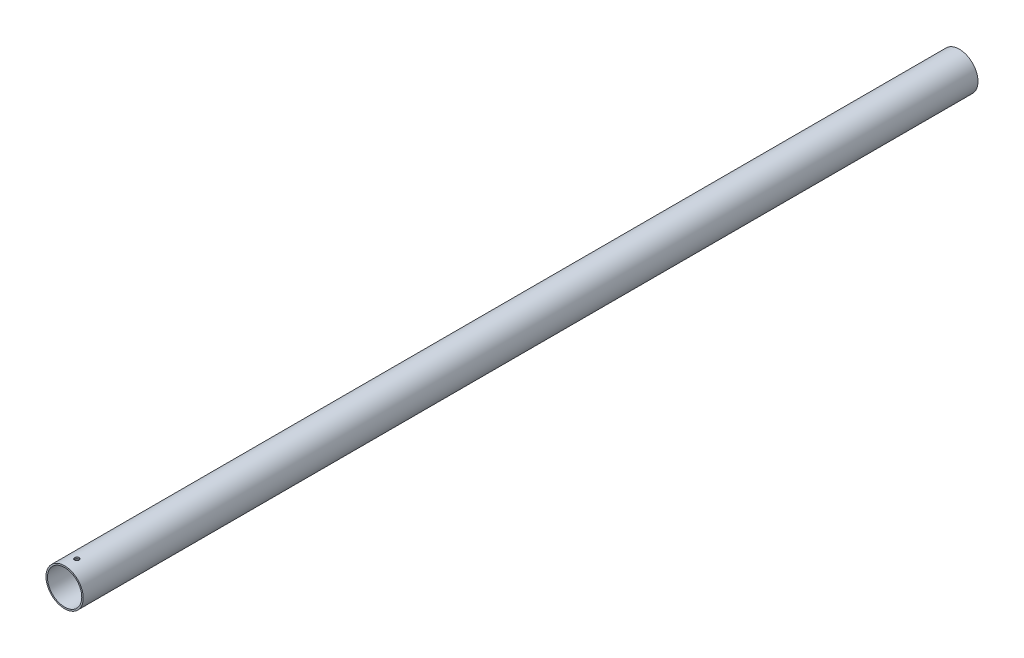
ISO-10303-21;
HEADER;
FILE_DESCRIPTION(('STEP AP214'),'2;1');
FILE_NAME('part.step','',(''),(''),'','','');
FILE_SCHEMA(('AUTOMOTIVE_DESIGN { 1 0 10303 214 1 1 1 1 }'));
ENDSEC;
DATA;
#1=APPLICATION_CONTEXT('core data for automotive mechanical design processes');
#2=APPLICATION_PROTOCOL_DEFINITION('international standard','automotive_design',2000,#1);
#3=PRODUCT_CONTEXT('',#1,'mechanical');
#4=PRODUCT('Part','Part','',(#3));
#5=PRODUCT_RELATED_PRODUCT_CATEGORY('part','',(#4));
#6=PRODUCT_DEFINITION_FORMATION('','',#4);
#7=PRODUCT_DEFINITION_CONTEXT('part definition',#1,'design');
#8=PRODUCT_DEFINITION('design','',#6,#7);
#9=PRODUCT_DEFINITION_SHAPE('','',#8);
#10=(LENGTH_UNIT() NAMED_UNIT(*) SI_UNIT(.MILLI.,.METRE.));
#11=(NAMED_UNIT(*) PLANE_ANGLE_UNIT() SI_UNIT($,.RADIAN.));
#12=(NAMED_UNIT(*) SI_UNIT($,.STERADIAN.) SOLID_ANGLE_UNIT());
#13=UNCERTAINTY_MEASURE_WITH_UNIT(LENGTH_MEASURE(1.E-05),#10,'distance_accuracy_value','');
#14=(GEOMETRIC_REPRESENTATION_CONTEXT(3) GLOBAL_UNCERTAINTY_ASSIGNED_CONTEXT((#13)) GLOBAL_UNIT_ASSIGNED_CONTEXT((#10,
#11,#12)) REPRESENTATION_CONTEXT('',''));
#15=CARTESIAN_POINT('',(0.,0.,0.));
#16=DIRECTION('',(0.,0.,1.));
#17=DIRECTION('',(1.,0.,0.));
#18=AXIS2_PLACEMENT_3D('',#15,#16,#17);
#19=CARTESIAN_POINT('',(0.,0.,600.));
#20=DIRECTION('',(0.,0.,-1.));
#21=DIRECTION('',(-1.,0.,0.));
#22=AXIS2_PLACEMENT_3D('',#19,#20,#21);
#23=CYLINDRICAL_SURFACE('',#22,12.5);
#24=CARTESIAN_POINT('',(0.,0.,600.));
#25=DIRECTION('',(0.,0.,1.));
#26=DIRECTION('',(1.,0.,0.));
#27=AXIS2_PLACEMENT_3D('',#24,#25,#26);
#28=CIRCLE('',#27,12.5);
#29=CARTESIAN_POINT('',(12.5,0.,600.));
#30=VERTEX_POINT('',#29);
#31=EDGE_CURVE('E10',#30,#30,#28,.T.);
#32=ORIENTED_EDGE('',*,*,#31,.F.);
#33=EDGE_LOOP('',(#32));
#34=FACE_BOUND('',#33,.T.);
#35=CARTESIAN_POINT('',(0.,0.,0.));
#36=DIRECTION('',(0.,0.,1.));
#37=DIRECTION('',(1.,0.,0.));
#38=AXIS2_PLACEMENT_3D('',#35,#36,#37);
#39=CIRCLE('',#38,12.5);
#40=CARTESIAN_POINT('',(12.5,0.,0.));
#41=VERTEX_POINT('',#40);
#42=EDGE_CURVE('E45',#41,#41,#39,.T.);
#43=ORIENTED_EDGE('',*,*,#42,.T.);
#44=EDGE_LOOP('',(#43));
#45=FACE_BOUND('',#44,.T.);
#46=CARTESIAN_POINT('',(0.,12.5,590.35));
#47=CARTESIAN_POINT('',(-0.0839320235538534,12.499998867873,590.350003581971));
#48=CARTESIAN_POINT('',(-0.167917158665603,12.4991457100204,590.357068329346));
#49=CARTESIAN_POINT('',(-0.333552285654133,12.495824352711,590.385140532078));
#50=CARTESIAN_POINT('',(-0.415199714795039,12.4933544466864,590.406162720625));
#51=CARTESIAN_POINT('',(-0.573737397670281,12.4870779632713,590.461523138263));
#52=CARTESIAN_POINT('',(-0.650630743796155,12.4832722657654,590.495852603412));
#53=CARTESIAN_POINT('',(-0.797549578916047,12.4747479632173,590.576834367542));
#54=CARTESIAN_POINT('',(-0.867576283567626,12.470029520207,590.623484479877));
#55=CARTESIAN_POINT('',(-0.999145657672302,12.460180052721,590.728037430988));
#56=CARTESIAN_POINT('',(-1.06064834565364,12.4550472515452,590.785990420056));
#57=CARTESIAN_POINT('',(-1.17307965519173,12.4449619698576,590.911396482444));
#58=CARTESIAN_POINT('',(-1.22400774913237,12.4400094983534,590.978850029509));
#59=CARTESIAN_POINT('',(-1.31399171436948,12.4308280185202,591.121600412649));
#60=CARTESIAN_POINT('',(-1.35301037836286,12.4266012951985,591.19692086229));
#61=CARTESIAN_POINT('',(-1.41783028650782,12.4193730672343,591.353104351055));
#62=CARTESIAN_POINT('',(-1.44363199348389,12.4163715196899,591.433967195985));
#63=CARTESIAN_POINT('',(-1.481164650227,12.4119503036869,591.598526429656));
#64=CARTESIAN_POINT('',(-1.49296288993823,12.4105230726271,591.682207264214));
#65=CARTESIAN_POINT('',(-1.50236187609836,12.4093888845306,591.850372468182));
#66=CARTESIAN_POINT('',(-1.49996315026425,12.4096818635516,591.934856807609));
#67=CARTESIAN_POINT('',(-1.48109158039333,12.4119480733153,592.101762982392));
#68=CARTESIAN_POINT('',(-1.46469271611149,12.4139124717338,592.18419331934));
#69=CARTESIAN_POINT('',(-1.41840173085029,12.4192864043804,592.345123513911));
#70=CARTESIAN_POINT('',(-1.38850935612902,12.4226959657844,592.42362329759));
#71=CARTESIAN_POINT('',(-1.31599990349924,12.4305861039738,592.57469473412));
#72=CARTESIAN_POINT('',(-1.27335053101955,12.4350693931099,592.647250739177));
#73=CARTESIAN_POINT('',(-1.17656086584729,12.444599699395,592.784203605458));
#74=CARTESIAN_POINT('',(-1.12242008861575,12.4496467403106,592.848600122451));
#75=CARTESIAN_POINT('',(-1.00377377781089,12.4597751654319,592.967835542182));
#76=CARTESIAN_POINT('',(-0.93920445025607,12.464856563712,593.022610984929));
#77=CARTESIAN_POINT('',(-0.801753979469325,12.4744510399275,593.1205557605));
#78=CARTESIAN_POINT('',(-0.728872819539963,12.478964116721,593.16372507001));
#79=CARTESIAN_POINT('',(-0.576819654131347,12.4869159430851,593.23723164282));
#80=CARTESIAN_POINT('',(-0.497645789357728,12.4903543736405,593.267565096665));
#81=CARTESIAN_POINT('',(-0.335278011136669,12.4957665326545,593.314489368926));
#82=CARTESIAN_POINT('',(-0.25208427122077,12.4977403242792,593.331080780002));
#83=CARTESIAN_POINT('',(-0.0845871981870783,12.4999926250152,593.349968127749));
#84=CARTESIAN_POINT('',(-0.000293860215998482,12.5002815046876,593.3523515162));
#85=CARTESIAN_POINT('',(0.167491034121661,12.4991593911616,593.342985711066));
#86=CARTESIAN_POINT('',(0.250982606163701,12.4977484312654,593.331236794352));
#87=CARTESIAN_POINT('',(0.414537131964228,12.4933916690343,593.294012517999));
#88=CARTESIAN_POINT('',(0.494609673184573,12.4904505118954,593.268578693475));
#89=CARTESIAN_POINT('',(0.64935269884329,12.4833627750896,593.204749648323));
#90=CARTESIAN_POINT('',(0.724023012961798,12.4792161574379,593.166354019255));
#91=CARTESIAN_POINT('',(0.866233588832555,12.4701542579347,593.077478542049));
#92=CARTESIAN_POINT('',(0.933738144813757,12.4652354042322,593.026941931095));
#93=CARTESIAN_POINT('',(1.05933812576101,12.455190895971,592.915299576796));
#94=CARTESIAN_POINT('',(1.11743320736475,12.4500652338742,592.854193447926));
#95=CARTESIAN_POINT('',(1.22287397613081,12.4401529742471,592.722762192286));
#96=CARTESIAN_POINT('',(1.27016181615975,12.4353682915654,592.652390492328));
#97=CARTESIAN_POINT('',(1.35224657214671,12.4267107496692,592.504652487462));
#98=CARTESIAN_POINT('',(1.3870437217804,12.4228378733971,592.427286313441));
#99=CARTESIAN_POINT('',(1.44306498334079,12.4164552867251,592.267944695553));
#100=CARTESIAN_POINT('',(1.46432210079672,12.4139422637816,592.18598099407));
#101=CARTESIAN_POINT('',(1.49276636081758,12.4105542637293,592.019615515258));
#102=CARTESIAN_POINT('',(1.49995410263041,12.4096792168553,591.935213841921));
#103=CARTESIAN_POINT('',(1.50004516908965,12.4096681633035,591.766943635182));
#104=CARTESIAN_POINT('',(1.49303936835675,12.4105210931972,591.683075137115));
#105=CARTESIAN_POINT('',(1.46513424336046,12.4138461473713,591.517716606803));
#106=CARTESIAN_POINT('',(1.44423491411035,12.4163182722328,591.436226575412));
#107=CARTESIAN_POINT('',(1.38916369910274,12.4225998262293,591.277947730556));
#108=CARTESIAN_POINT('',(1.35499582785272,12.4264088508406,591.201157503252));
#109=CARTESIAN_POINT('',(1.27436641314007,12.4349357269569,591.054386126465));
#110=CARTESIAN_POINT('',(1.22790476354723,12.4396535863076,590.984405035771));
#111=CARTESIAN_POINT('',(1.12366844823602,12.4495027561294,590.852773529946));
#112=CARTESIAN_POINT('',(1.06582601965075,12.4546364290673,590.791176948367));
#113=CARTESIAN_POINT('',(0.940610466672239,12.4647177484085,590.678528760217));
#114=CARTESIAN_POINT('',(0.873235091317998,12.4696653505255,590.627479651185));
#115=CARTESIAN_POINT('',(0.730596612325658,12.4788360854662,590.537224711001));
#116=CARTESIAN_POINT('',(0.655306617312052,12.4830566108105,590.498061137139));
#117=CARTESIAN_POINT('',(0.499211375842594,12.4902709259863,590.432988117779));
#118=CARTESIAN_POINT('',(0.418412282180995,12.4932660590308,590.40706415191));
#119=CARTESIAN_POINT('',(0.280988550618286,12.4969634163,590.375468289831));
#120=CARTESIAN_POINT('',(0.225233284876701,12.4980966397165,590.365931258057));
#121=CARTESIAN_POINT('',(0.112993367846833,12.4996153102102,590.353195928255));
#122=CARTESIAN_POINT('',(0.0565087213768053,12.5000007622246,590.349997588375));
#123=CARTESIAN_POINT('',(0.,12.5,590.35));
#124=B_SPLINE_CURVE_WITH_KNOTS('',3,(#46,#47,#48,#49,#50,#51,#52,#53,#54,#55,#56,#57,#58,#59,
#60,#61,#62,#63,#64,#65,#66,#67,#68,#69,#70,#71,#72,#73,#74,#75,#76,#77,#78,#79,#80,#81,#82,#83,
#84,#85,#86,#87,#88,#89,#90,#91,#92,#93,#94,#95,#96,#97,#98,#99,#100,#101,#102,#103,#104,#105,
#106,#107,#108,#109,#110,#111,#112,#113,#114,#115,#116,#117,#118,#119,#120,#121,#122,#123),
.UNSPECIFIED.,.T.,.F.,(4,2,2,2,2,2,2,2,2,2,2,2,2,2,2,2,2,2,2,2,2,2,2,2,2,2,2,2,2,2,2,2,2,2,2,2,
2,2,4),(0.,0.251589675478073,0.503445347043145,0.755135431877851,1.0067808772085,
1.25956936097947,1.51237045452444,1.76595344748193,2.01952755999561,2.27187819171638,
2.52421944334244,2.77523546456133,3.02625620626707,3.27791786855274,3.5295901443463,
3.78286472320161,4.03613981086305,4.28949001347145,4.54282928911311,4.79460761312114,
5.04638100450543,5.29739451278882,5.54841593150836,5.80063460892784,6.05286248801784,
6.30641037908369,6.55995352653158,6.81287624132441,7.06578818330768,7.31708596596134,
7.5683838388117,7.81960573856934,8.07082980715604,8.32359762010159,8.57642521760048,
8.83014145119735,9.0835788239638,9.25296714728136,9.42235435219903),.UNSPECIFIED.);
#125=CARTESIAN_POINT('',(0.,12.5,590.35));
#126=VERTEX_POINT('',#125);
#127=EDGE_CURVE('E55',#126,#126,#124,.T.);
#128=ORIENTED_EDGE('',*,*,#127,.F.);
#129=EDGE_LOOP('',(#128));
#130=FACE_BOUND('',#129,.T.);
#131=ADVANCED_FACE('F33',(#34,#45,#130),#23,.T.);
#132=CARTESIAN_POINT('',(0.,0.,600.));
#133=DIRECTION('',(0.,0.,-1.));
#134=DIRECTION('',(-1.,0.,0.));
#135=AXIS2_PLACEMENT_3D('',#132,#133,#134);
#136=CYLINDRICAL_SURFACE('',#135,11.5);
#137=CARTESIAN_POINT('',(0.,0.,0.));
#138=DIRECTION('',(0.,0.,1.));
#139=DIRECTION('',(1.,0.,0.));
#140=AXIS2_PLACEMENT_3D('',#137,#138,#139);
#141=CIRCLE('',#140,11.5);
#142=CARTESIAN_POINT('',(11.5,0.,0.));
#143=VERTEX_POINT('',#142);
#144=EDGE_CURVE('E52',#143,#143,#141,.T.);
#145=ORIENTED_EDGE('',*,*,#144,.F.);
#146=EDGE_LOOP('',(#145));
#147=FACE_BOUND('',#146,.T.);
#148=CARTESIAN_POINT('',(0.,0.,600.));
#149=DIRECTION('',(0.,0.,1.));
#150=DIRECTION('',(1.,0.,0.));
#151=AXIS2_PLACEMENT_3D('',#148,#149,#150);
#152=CIRCLE('',#151,11.5);
#153=CARTESIAN_POINT('',(11.5,0.,600.));
#154=VERTEX_POINT('',#153);
#155=EDGE_CURVE('E50',#154,#154,#152,.T.);
#156=ORIENTED_EDGE('',*,*,#155,.T.);
#157=EDGE_LOOP('',(#156));
#158=FACE_BOUND('',#157,.T.);
#159=CARTESIAN_POINT('',(0.,11.5,590.35));
#160=CARTESIAN_POINT('',(-0.0838736754757332,11.4999987889706,590.350003543992));
#161=CARTESIAN_POINT('',(-0.167799007864513,11.4990727424738,590.357058519002));
#162=CARTESIAN_POINT('',(-0.333312197058596,11.4954676443032,590.38508962833));
#163=CARTESIAN_POINT('',(-0.414897556062034,11.4927867872035,590.406080100413));
#164=CARTESIAN_POINT('',(-0.573310862574369,11.4859739305166,590.461351431224));
#165=CARTESIAN_POINT('',(-0.65014205015743,11.4818429323362,590.495623120191));
#166=CARTESIAN_POINT('',(-0.796948541825213,11.4725886401554,590.576463483544));
#167=CARTESIAN_POINT('',(-0.866924973730839,11.4674655098059,590.62303013035));
#168=CARTESIAN_POINT('',(-0.998467584282105,11.4567642658025,590.727435703181));
#169=CARTESIAN_POINT('',(-1.05998690599807,11.4511838707794,590.785333437357));
#170=CARTESIAN_POINT('',(-1.1724652872007,11.4402153265713,590.910631332133));
#171=CARTESIAN_POINT('',(-1.22342379516466,11.4348271874387,590.9780319887));
#172=CARTESIAN_POINT('',(-1.31351024770353,11.4248308534604,591.120729192845));
#173=CARTESIAN_POINT('',(-1.35259398609598,11.4202256004087,591.196053872172));
#174=CARTESIAN_POINT('',(-1.4175391089576,11.4123468049196,591.352267945457));
#175=CARTESIAN_POINT('',(-1.44340103860291,11.4090732075752,591.433157109818));
#176=CARTESIAN_POINT('',(-1.48102535604964,11.4042503168758,591.597716224691));
#177=CARTESIAN_POINT('',(-1.49286711031844,11.4026913209814,591.681367739717));
#178=CARTESIAN_POINT('',(-1.50236057802514,11.4014445124782,591.849484115064));
#179=CARTESIAN_POINT('',(-1.50001291116,11.4017566181525,591.933948939704));
#180=CARTESIAN_POINT('',(-1.48125926874543,11.4042078698223,592.100739656578));
#181=CARTESIAN_POINT('',(-1.46494091291053,11.406335628348,592.18307559182));
#182=CARTESIAN_POINT('',(-1.41884591021785,11.4121606755201,592.343830423863));
#183=CARTESIAN_POINT('',(-1.38906896860544,11.4158579985412,592.422249234835));
#184=CARTESIAN_POINT('',(-1.31680849453618,11.4244184254903,592.573214859267));
#185=CARTESIAN_POINT('',(-1.27428708175247,11.4292849960909,592.645743336513));
#186=CARTESIAN_POINT('',(-1.17777176527461,11.4396329366713,592.782668480963));
#187=CARTESIAN_POINT('',(-1.12377729049836,11.4451143372484,592.847064743124));
#188=CARTESIAN_POINT('',(-1.00536389947363,11.4561248839527,592.966405906027));
#189=CARTESIAN_POINT('',(-0.940869497437084,11.4616540786179,593.021275931088));
#190=CARTESIAN_POINT('',(-0.803546382709048,11.4720986286903,593.119423402524));
#191=CARTESIAN_POINT('',(-0.730717647775638,11.4770139824593,593.162700817961));
#192=CARTESIAN_POINT('',(-0.578734018158934,11.4856804659311,593.236435402249));
#193=CARTESIAN_POINT('',(-0.499576715280734,11.4894311497676,593.266887662881));
#194=CARTESIAN_POINT('',(-0.33721230708206,11.4953417256298,593.314046930639));
#195=CARTESIAN_POINT('',(-0.254005408543459,11.4975016987903,593.330754638816));
#196=CARTESIAN_POINT('',(-0.0865509170951943,11.4999768972913,593.349852977556));
#197=CARTESIAN_POINT('',(-0.00231527186088997,11.500305406974,593.35234671077));
#198=CARTESIAN_POINT('',(0.165372777140086,11.4991165911979,593.343218719994));
#199=CARTESIAN_POINT('',(0.248825199059504,11.497599308626,593.331597323967));
#200=CARTESIAN_POINT('',(0.412272035475333,11.4928976520939,593.294654636));
#201=CARTESIAN_POINT('',(0.492277798076589,11.4897192880654,593.269382721795));
#202=CARTESIAN_POINT('',(0.64691586058683,11.48205116634,593.205907859047));
#203=CARTESIAN_POINT('',(0.72154796329182,11.4775613605459,593.167704436233));
#204=CARTESIAN_POINT('',(0.863779209036508,11.4677374606315,593.079203095521));
#205=CARTESIAN_POINT('',(0.931336693285041,11.4623987859822,593.028838744737));
#206=CARTESIAN_POINT('',(1.05707662855491,11.4514881052812,592.917538886379));
#207=CARTESIAN_POINT('',(1.11525867281436,11.4459160891191,592.856602920383));
#208=CARTESIAN_POINT('',(1.22096386356529,11.435125505803,592.72543441349));
#209=CARTESIAN_POINT('',(1.26841850564584,11.4299093510067,592.655146439096));
#210=CARTESIAN_POINT('',(1.3508479872636,11.4204613909882,592.507537067047));
#211=CARTESIAN_POINT('',(1.38582309548537,11.416229564574,592.430215820865));
#212=CARTESIAN_POINT('',(1.44219073788251,11.4092460653583,592.270952405338));
#213=CARTESIAN_POINT('',(1.46362137263959,11.4064902439233,592.18902391055));
#214=CARTESIAN_POINT('',(1.49241416148135,11.4027590627917,592.02269273086));
#215=CARTESIAN_POINT('',(1.49977703312959,11.4017836122826,591.938290172377));
#216=CARTESIAN_POINT('',(1.50021133318705,11.4017264204224,591.77008850105));
#217=CARTESIAN_POINT('',(1.49339039767638,11.4026304165807,591.68628965071));
#218=CARTESIAN_POINT('',(1.46587918768881,11.4061995300276,591.521040560147));
#219=CARTESIAN_POINT('',(1.44518891595682,11.4088646469677,591.439590319458));
#220=CARTESIAN_POINT('',(1.39056092558022,11.4156511823152,591.281367885186));
#221=CARTESIAN_POINT('',(1.35662887172563,11.4197719779168,591.204593707414));
#222=CARTESIAN_POINT('',(1.2764911013053,11.4290065281123,591.057811353931));
#223=CARTESIAN_POINT('',(1.23028517717274,11.4341202994982,590.987803292672));
#224=CARTESIAN_POINT('',(1.12651352497628,11.4448110546929,590.855990832852));
#225=CARTESIAN_POINT('',(1.06886765466835,11.4503911357269,590.794249773828));
#226=CARTESIAN_POINT('',(0.944020432211586,11.4613587220616,590.681276906554));
#227=CARTESIAN_POINT('',(0.876816837734336,11.4667461817993,590.630047571359));
#228=CARTESIAN_POINT('',(0.734440983208692,11.4767463223463,590.539369813003));
#229=CARTESIAN_POINT('',(0.659236923265504,11.4813557074918,590.499970977416));
#230=CARTESIAN_POINT('',(0.503260285581688,11.4892472513977,590.434418734786));
#231=CARTESIAN_POINT('',(0.422493808644753,11.4925308379763,590.408251070733));
#232=CARTESIAN_POINT('',(0.284433485182439,11.4966176944656,590.376102069841));
#233=CARTESIAN_POINT('',(0.228006817894466,11.4978798128957,590.366328038441));
#234=CARTESIAN_POINT('',(0.114394773946347,11.4995713752256,590.353275821797));
#235=CARTESIAN_POINT('',(0.0572094035825733,11.5000008260312,590.349997582678));
#236=CARTESIAN_POINT('',(0.,11.5,590.35));
#237=B_SPLINE_CURVE_WITH_KNOTS('',3,(#159,#160,#161,#162,#163,#164,#165,#166,#167,#168,#169,
#170,#171,#172,#173,#174,#175,#176,#177,#178,#179,#180,#181,#182,#183,#184,#185,#186,#187,#188,
#189,#190,#191,#192,#193,#194,#195,#196,#197,#198,#199,#200,#201,#202,#203,#204,#205,#206,#207,
#208,#209,#210,#211,#212,#213,#214,#215,#216,#217,#218,#219,#220,#221,#222,#223,#224,#225,#226,
#227,#228,#229,#230,#231,#232,#233,#234,#235,#236),.UNSPECIFIED.,.T.,.F.,(4,2,2,2,2,2,2,2,2,2,2,
2,2,2,2,2,2,2,2,2,2,2,2,2,2,2,2,2,2,2,2,2,2,2,2,2,2,2,4),(0.,0.251412042547968,
0.503083156235439,0.754580817165489,1.00603702914678,1.25883466510251,1.51164549971162,
1.76538625583099,2.01911654858886,2.27140353166935,2.52367949665769,2.7743847613694,
3.02509551700845,3.27655897620062,3.5280349551487,3.78140588995849,4.03477750095767,
4.28824598999316,4.54170154988327,4.79331627883388,5.04492516164323,5.29562994105657,
5.54634391621591,5.79845977877208,6.05058657665799,6.30428060859522,6.55796917816595,
6.81094090821308,7.06389973442203,7.31494594958272,7.56599211505825,7.81693100134911,
8.06787413160716,8.32064158523557,8.57346843851721,8.82734068052481,9.08093878097967,
9.25242586815101,9.42391153306392),.UNSPECIFIED.);
#238=CARTESIAN_POINT('',(0.,11.5,590.35));
#239=VERTEX_POINT('',#238);
#240=EDGE_CURVE('E37',#239,#239,#237,.T.);
#241=ORIENTED_EDGE('',*,*,#240,.T.);
#242=EDGE_LOOP('',(#241));
#243=FACE_BOUND('',#242,.T.);
#244=ADVANCED_FACE('F66',(#147,#158,#243),#136,.F.);
#245=CARTESIAN_POINT('',(0.,0.,600.));
#246=DIRECTION('',(0.,0.,1.));
#247=DIRECTION('',(1.,0.,0.));
#248=AXIS2_PLACEMENT_3D('',#245,#246,#247);
#249=PLANE('',#248);
#250=ORIENTED_EDGE('',*,*,#31,.T.);
#251=EDGE_LOOP('',(#250));
#252=FACE_BOUND('',#251,.T.);
#253=ORIENTED_EDGE('',*,*,#155,.F.);
#254=EDGE_LOOP('',(#253));
#255=FACE_BOUND('',#254,.T.);
#256=ADVANCED_FACE('F71',(#252,#255),#249,.T.);
#257=CARTESIAN_POINT('',(0.,0.,0.));
#258=DIRECTION('',(0.,0.,1.));
#259=DIRECTION('',(1.,0.,0.));
#260=AXIS2_PLACEMENT_3D('',#257,#258,#259);
#261=PLANE('',#260);
#262=ORIENTED_EDGE('',*,*,#42,.F.);
#263=EDGE_LOOP('',(#262));
#264=FACE_BOUND('',#263,.T.);
#265=ORIENTED_EDGE('',*,*,#144,.T.);
#266=EDGE_LOOP('',(#265));
#267=FACE_BOUND('',#266,.T.);
#268=ADVANCED_FACE('F64',(#264,#267),#261,.F.);
#269=CARTESIAN_POINT('',(0.,12.5,591.85));
#270=DIRECTION('',(0.,-1.,0.));
#271=DIRECTION('',(0.,0.,-1.));
#272=AXIS2_PLACEMENT_3D('',#269,#270,#271);
#273=CYLINDRICAL_SURFACE('',#272,1.5);
#274=ORIENTED_EDGE('',*,*,#240,.F.);
#275=EDGE_LOOP('',(#274));
#276=FACE_BOUND('',#275,.T.);
#277=ORIENTED_EDGE('',*,*,#127,.T.);
#278=EDGE_LOOP('',(#277));
#279=FACE_BOUND('',#278,.T.);
#280=ADVANCED_FACE('F61',(#276,#279),#273,.F.);
#281=CLOSED_SHELL('',(#131,#244,#256,#268,#280));
#282=MANIFOLD_SOLID_BREP('B2',#281);
#283=ADVANCED_BREP_SHAPE_REPRESENTATION('',(#18,#282),#14);
#284=SHAPE_DEFINITION_REPRESENTATION(#9,#283);
ENDSEC;
END-ISO-10303-21;
